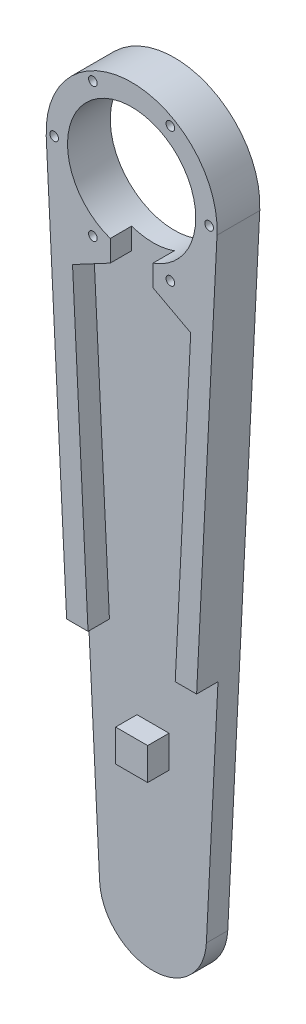
ISO-10303-21;
HEADER;
FILE_DESCRIPTION(('STEP AP214'),'2;1');
FILE_NAME('part.step','',(''),(''),'','','');
FILE_SCHEMA(('AUTOMOTIVE_DESIGN { 1 0 10303 214 1 1 1 1 }'));
ENDSEC;
DATA;
#1=APPLICATION_CONTEXT('core data for automotive mechanical design processes');
#2=APPLICATION_PROTOCOL_DEFINITION('international standard','automotive_design',2000,#1);
#3=PRODUCT_CONTEXT('',#1,'mechanical');
#4=PRODUCT('Part','Part','',(#3));
#5=PRODUCT_RELATED_PRODUCT_CATEGORY('part','',(#4));
#6=PRODUCT_DEFINITION_FORMATION('','',#4);
#7=PRODUCT_DEFINITION_CONTEXT('part definition',#1,'design');
#8=PRODUCT_DEFINITION('design','',#6,#7);
#9=PRODUCT_DEFINITION_SHAPE('','',#8);
#10=(LENGTH_UNIT() NAMED_UNIT(*) SI_UNIT(.MILLI.,.METRE.));
#11=(NAMED_UNIT(*) PLANE_ANGLE_UNIT() SI_UNIT($,.RADIAN.));
#12=(NAMED_UNIT(*) SI_UNIT($,.STERADIAN.) SOLID_ANGLE_UNIT());
#13=UNCERTAINTY_MEASURE_WITH_UNIT(LENGTH_MEASURE(1.E-05),#10,'distance_accuracy_value','');
#14=(GEOMETRIC_REPRESENTATION_CONTEXT(3) GLOBAL_UNCERTAINTY_ASSIGNED_CONTEXT((#13)) GLOBAL_UNIT_ASSIGNED_CONTEXT((#10,
#11,#12)) REPRESENTATION_CONTEXT('',''));
#15=CARTESIAN_POINT('',(0.,0.,0.));
#16=DIRECTION('',(0.,0.,1.));
#17=DIRECTION('',(1.,0.,0.));
#18=AXIS2_PLACEMENT_3D('',#15,#16,#17);
#19=CARTESIAN_POINT('',(0.,0.,0.));
#20=DIRECTION('',(0.,0.,1.));
#21=DIRECTION('',(1.,0.,0.));
#22=AXIS2_PLACEMENT_3D('',#19,#20,#21);
#23=PLANE('',#22);
#24=DIRECTION('',(-1.,0.,0.));
#25=VECTOR('',#24,1.);
#26=CARTESIAN_POINT('',(0.,-192.690398551587,0.));
#27=LINE('',#26,#25);
#28=CARTESIAN_POINT('',(-20.3909847537626,-192.690398551587,0.));
#29=VERTEX_POINT('',#28);
#30=CARTESIAN_POINT('',(-30.4035082401991,-192.690398551587,0.));
#31=VERTEX_POINT('',#30);
#32=EDGE_CURVE('E240',#29,#31,#27,.T.);
#33=ORIENTED_EDGE('',*,*,#32,.T.);
#34=DIRECTION('',(0.05,-0.998749217771909,0.));
#35=VECTOR('',#34,1.);
#36=CARTESIAN_POINT('',(-39.9499687108764,-2.,0.));
#37=LINE('',#36,#35);
#38=CARTESIAN_POINT('',(-24.9687304442977,-301.25,0.));
#39=VERTEX_POINT('',#38);
#40=EDGE_CURVE('E330',#31,#39,#37,.T.);
#41=ORIENTED_EDGE('',*,*,#40,.T.);
#42=CARTESIAN_POINT('',(0.,-300.,0.));
#43=DIRECTION('',(0.,0.,1.));
#44=DIRECTION('',(1.,0.,0.));
#45=AXIS2_PLACEMENT_3D('',#42,#43,#44);
#46=CIRCLE('',#45,25.);
#47=CARTESIAN_POINT('',(24.9687304442977,-301.25,0.));
#48=VERTEX_POINT('',#47);
#49=EDGE_CURVE('E339',#39,#48,#46,.T.);
#50=ORIENTED_EDGE('',*,*,#49,.T.);
#51=DIRECTION('',(-0.05,-0.998749217771909,0.));
#52=VECTOR('',#51,1.);
#53=CARTESIAN_POINT('',(39.9499687108764,-2.,0.));
#54=LINE('',#53,#52);
#55=CARTESIAN_POINT('',(30.4035082401991,-192.690398551587,0.));
#56=VERTEX_POINT('',#55);
#57=EDGE_CURVE('E334',#56,#48,#54,.T.);
#58=ORIENTED_EDGE('',*,*,#57,.F.);
#59=DIRECTION('',(1.,0.,0.));
#60=VECTOR('',#59,1.);
#61=CARTESIAN_POINT('',(0.,-192.690398551587,0.));
#62=LINE('',#61,#60);
#63=CARTESIAN_POINT('',(20.390984753764,-192.690398551587,0.));
#64=VERTEX_POINT('',#63);
#65=EDGE_CURVE('E255',#64,#56,#62,.T.);
#66=ORIENTED_EDGE('',*,*,#65,.F.);
#67=DIRECTION('',(-0.0499999999999999,-0.998749217771909,0.));
#68=VECTOR('',#67,1.);
#69=CARTESIAN_POINT('',(29.9624765331573,-1.5,0.));
#70=LINE('',#69,#68);
#71=CARTESIAN_POINT('',(27.6500642814294,-47.690398551587,0.));
#72=VERTEX_POINT('',#71);
#73=EDGE_CURVE('E252',#72,#64,#70,.T.);
#74=ORIENTED_EDGE('',*,*,#73,.F.);
#75=DIRECTION('',(0.882503214071472,-0.470306365206257,0.));
#76=VECTOR('',#75,1.);
#77=CARTESIAN_POINT('',(-13.677886520409,-25.665778116084,0.));
#78=LINE('',#77,#76);
#79=CARTESIAN_POINT('',(10.,-38.2842712474619,0.));
#80=VERTEX_POINT('',#79);
#81=EDGE_CURVE('E249',#80,#72,#78,.T.);
#82=ORIENTED_EDGE('',*,*,#81,.F.);
#83=DIRECTION('',(0.,-1.,0.));
#84=VECTOR('',#83,1.);
#85=CARTESIAN_POINT('',(10.,0.,0.));
#86=LINE('',#85,#84);
#87=CARTESIAN_POINT('',(10.,-28.2842712474619,0.));
#88=VERTEX_POINT('',#87);
#89=EDGE_CURVE('E246',#88,#80,#86,.T.);
#90=ORIENTED_EDGE('',*,*,#89,.F.);
#91=CARTESIAN_POINT('',(0.,0.,0.));
#92=DIRECTION('',(0.,0.,1.));
#93=DIRECTION('',(1.,0.,0.));
#94=AXIS2_PLACEMENT_3D('',#91,#92,#93);
#95=CIRCLE('',#94,30.);
#96=CARTESIAN_POINT('',(-9.9999999999998,-28.284271247462,0.));
#97=VERTEX_POINT('',#96);
#98=EDGE_CURVE('E386',#97,#88,#95,.T.);
#99=ORIENTED_EDGE('',*,*,#98,.F.);
#100=DIRECTION('',(0.,-1.,0.));
#101=VECTOR('',#100,1.);
#102=CARTESIAN_POINT('',(-10.,0.,0.));
#103=LINE('',#102,#101);
#104=CARTESIAN_POINT('',(-9.99999999999973,-38.2842712474619,0.));
#105=VERTEX_POINT('',#104);
#106=EDGE_CURVE('E244',#97,#105,#103,.T.);
#107=ORIENTED_EDGE('',*,*,#106,.T.);
#108=DIRECTION('',(-0.882503214071467,-0.470306365206267,0.));
#109=VECTOR('',#108,1.);
#110=CARTESIAN_POINT('',(13.6778865204092,-25.6657781160837,0.));
#111=LINE('',#110,#109);
#112=CARTESIAN_POINT('',(-27.6500642814291,-47.6903985515873,0.));
#113=VERTEX_POINT('',#112);
#114=EDGE_CURVE('E63',#105,#113,#111,.T.);
#115=ORIENTED_EDGE('',*,*,#114,.T.);
#116=DIRECTION('',(0.0500000000000069,-0.998749217771909,0.));
#117=VECTOR('',#116,1.);
#118=CARTESIAN_POINT('',(-29.9624765331573,-1.50000000000021,0.));
#119=LINE('',#118,#117);
#120=EDGE_CURVE('E58',#113,#29,#119,.T.);
#121=ORIENTED_EDGE('',*,*,#120,.T.);
#122=EDGE_LOOP('',(#33,#41,#50,#58,#66,#74,#82,#90,#99,#107,#115,#121));
#123=FACE_BOUND('',#122,.T.);
#124=DIRECTION('',(0.,-1.,0.));
#125=VECTOR('',#124,1.);
#126=CARTESIAN_POINT('',(-7.50000000000003,0.,0.));
#127=LINE('',#126,#125);
#128=CARTESIAN_POINT('',(-7.5,-225.,0.));
#129=VERTEX_POINT('',#128);
#130=CARTESIAN_POINT('',(-7.5,-240.,0.));
#131=VERTEX_POINT('',#130);
#132=EDGE_CURVE('E312',#129,#131,#127,.T.);
#133=ORIENTED_EDGE('',*,*,#132,.F.);
#134=DIRECTION('',(-1.,0.,0.));
#135=VECTOR('',#134,1.);
#136=CARTESIAN_POINT('',(0.,-225.,0.));
#137=LINE('',#136,#135);
#138=CARTESIAN_POINT('',(7.50000000000002,-225.,0.));
#139=VERTEX_POINT('',#138);
#140=EDGE_CURVE('E297',#139,#129,#137,.T.);
#141=ORIENTED_EDGE('',*,*,#140,.F.);
#142=DIRECTION('',(0.,-1.,0.));
#143=VECTOR('',#142,1.);
#144=CARTESIAN_POINT('',(7.50000000000003,0.,0.));
#145=LINE('',#144,#143);
#146=CARTESIAN_POINT('',(7.5,-240.,0.));
#147=VERTEX_POINT('',#146);
#148=EDGE_CURVE('E302',#139,#147,#145,.T.);
#149=ORIENTED_EDGE('',*,*,#148,.T.);
#150=DIRECTION('',(1.,0.,0.));
#151=VECTOR('',#150,1.);
#152=CARTESIAN_POINT('',(0.,-240.,0.));
#153=LINE('',#152,#151);
#154=EDGE_CURVE('E315',#131,#147,#153,.T.);
#155=ORIENTED_EDGE('',*,*,#154,.F.);
#156=EDGE_LOOP('',(#133,#141,#149,#155));
#157=FACE_BOUND('',#156,.T.);
#158=ADVANCED_FACE('F43',(#123,#157),#23,.T.);
#159=CARTESIAN_POINT('',(0.,0.,-10.));
#160=DIRECTION('',(0.,0.,1.));
#161=DIRECTION('',(1.,0.,0.));
#162=AXIS2_PLACEMENT_3D('',#159,#160,#161);
#163=CYLINDRICAL_SURFACE('',#162,40.);
#164=DIRECTION('',(0.,0.,1.));
#165=VECTOR('',#164,1.);
#166=CARTESIAN_POINT('',(-39.9499687108764,-2.,-10.));
#167=LINE('',#166,#165);
#168=CARTESIAN_POINT('',(-39.9499687108764,-2.,-10.));
#169=VERTEX_POINT('',#168);
#170=CARTESIAN_POINT('',(-39.9499687108764,-2.,10.));
#171=VERTEX_POINT('',#170);
#172=EDGE_CURVE('E167',#169,#171,#167,.T.);
#173=ORIENTED_EDGE('',*,*,#172,.T.);
#174=CARTESIAN_POINT('',(0.,0.,10.));
#175=DIRECTION('',(0.,0.,1.));
#176=DIRECTION('',(1.,0.,0.));
#177=AXIS2_PLACEMENT_3D('',#174,#175,#176);
#178=CIRCLE('',#177,40.);
#179=CARTESIAN_POINT('',(39.9499687108764,-2.,10.));
#180=VERTEX_POINT('',#179);
#181=EDGE_CURVE('E171',#180,#171,#178,.T.);
#182=ORIENTED_EDGE('',*,*,#181,.F.);
#183=DIRECTION('',(0.,0.,1.));
#184=VECTOR('',#183,1.);
#185=CARTESIAN_POINT('',(39.9499687108764,-2.,-10.));
#186=LINE('',#185,#184);
#187=CARTESIAN_POINT('',(39.9499687108764,-2.,-10.));
#188=VERTEX_POINT('',#187);
#189=EDGE_CURVE('E343',#188,#180,#186,.T.);
#190=ORIENTED_EDGE('',*,*,#189,.F.);
#191=CARTESIAN_POINT('',(0.,0.,-10.));
#192=DIRECTION('',(0.,0.,1.));
#193=DIRECTION('',(1.,0.,0.));
#194=AXIS2_PLACEMENT_3D('',#191,#192,#193);
#195=CIRCLE('',#194,40.);
#196=EDGE_CURVE('E11',#188,#169,#195,.T.);
#197=ORIENTED_EDGE('',*,*,#196,.T.);
#198=EDGE_LOOP('',(#173,#182,#190,#197));
#199=FACE_BOUND('',#198,.T.);
#200=ADVANCED_FACE('F45',(#199),#163,.T.);
#201=CARTESIAN_POINT('',(0.,0.,-10.));
#202=DIRECTION('',(0.,0.,1.));
#203=DIRECTION('',(1.,0.,0.));
#204=AXIS2_PLACEMENT_3D('',#201,#202,#203);
#205=PLANE('',#204);
#206=CARTESIAN_POINT('',(18.1250000000004,31.3934208871857,-10.));
#207=DIRECTION('',(0.,0.,1.));
#208=DIRECTION('',(1.,0.,0.));
#209=AXIS2_PLACEMENT_3D('',#206,#207,#208);
#210=CIRCLE('',#209,1.65);
#211=CARTESIAN_POINT('',(19.7750000000004,31.3934208871857,-10.));
#212=VERTEX_POINT('',#211);
#213=EDGE_CURVE('E353',#212,#212,#210,.T.);
#214=ORIENTED_EDGE('',*,*,#213,.T.);
#215=EDGE_LOOP('',(#214));
#216=FACE_BOUND('',#215,.T.);
#217=CARTESIAN_POINT('',(-18.1249999999997,31.3934208871861,-10.));
#218=DIRECTION('',(0.,0.,1.));
#219=DIRECTION('',(1.,0.,0.));
#220=AXIS2_PLACEMENT_3D('',#217,#218,#219);
#221=CIRCLE('',#220,1.65);
#222=CARTESIAN_POINT('',(-16.4749999999997,31.3934208871861,-10.));
#223=VERTEX_POINT('',#222);
#224=EDGE_CURVE('E359',#223,#223,#221,.T.);
#225=ORIENTED_EDGE('',*,*,#224,.T.);
#226=EDGE_LOOP('',(#225));
#227=FACE_BOUND('',#226,.T.);
#228=CARTESIAN_POINT('',(-36.25,0.,-10.));
#229=DIRECTION('',(0.,0.,1.));
#230=DIRECTION('',(1.,0.,0.));
#231=AXIS2_PLACEMENT_3D('',#228,#229,#230);
#232=CIRCLE('',#231,1.65);
#233=CARTESIAN_POINT('',(-34.6,0.,-10.));
#234=VERTEX_POINT('',#233);
#235=EDGE_CURVE('E365',#234,#234,#232,.T.);
#236=ORIENTED_EDGE('',*,*,#235,.T.);
#237=EDGE_LOOP('',(#236));
#238=FACE_BOUND('',#237,.T.);
#239=CARTESIAN_POINT('',(-18.1250000000001,-31.3934208871858,-10.));
#240=DIRECTION('',(0.,0.,1.));
#241=DIRECTION('',(1.,0.,0.));
#242=AXIS2_PLACEMENT_3D('',#239,#240,#241);
#243=CIRCLE('',#242,1.65);
#244=CARTESIAN_POINT('',(-16.4750000000002,-31.3934208871858,-10.));
#245=VERTEX_POINT('',#244);
#246=EDGE_CURVE('E371',#245,#245,#243,.T.);
#247=ORIENTED_EDGE('',*,*,#246,.T.);
#248=EDGE_LOOP('',(#247));
#249=FACE_BOUND('',#248,.T.);
#250=CARTESIAN_POINT('',(18.1249999999999,-31.3934208871859,-10.));
#251=DIRECTION('',(0.,0.,1.));
#252=DIRECTION('',(1.,0.,0.));
#253=AXIS2_PLACEMENT_3D('',#250,#251,#252);
#254=CIRCLE('',#253,1.65);
#255=CARTESIAN_POINT('',(19.7749999999999,-31.3934208871859,-10.));
#256=VERTEX_POINT('',#255);
#257=EDGE_CURVE('E377',#256,#256,#254,.T.);
#258=ORIENTED_EDGE('',*,*,#257,.T.);
#259=EDGE_LOOP('',(#258));
#260=FACE_BOUND('',#259,.T.);
#261=CARTESIAN_POINT('',(36.25,0.,-10.));
#262=DIRECTION('',(0.,0.,1.));
#263=DIRECTION('',(1.,0.,0.));
#264=AXIS2_PLACEMENT_3D('',#261,#262,#263);
#265=CIRCLE('',#264,1.65);
#266=CARTESIAN_POINT('',(37.9,0.,-10.));
#267=VERTEX_POINT('',#266);
#268=EDGE_CURVE('E383',#267,#267,#265,.T.);
#269=ORIENTED_EDGE('',*,*,#268,.T.);
#270=EDGE_LOOP('',(#269));
#271=FACE_BOUND('',#270,.T.);
#272=CARTESIAN_POINT('',(0.,0.,-10.));
#273=DIRECTION('',(0.,0.,1.));
#274=DIRECTION('',(1.,0.,0.));
#275=AXIS2_PLACEMENT_3D('',#272,#273,#274);
#276=CIRCLE('',#275,30.);
#277=CARTESIAN_POINT('',(30.,0.,-10.));
#278=VERTEX_POINT('',#277);
#279=EDGE_CURVE('E51',#278,#278,#276,.T.);
#280=ORIENTED_EDGE('',*,*,#279,.T.);
#281=EDGE_LOOP('',(#280));
#282=FACE_BOUND('',#281,.T.);
#283=ORIENTED_EDGE('',*,*,#196,.F.);
#284=DIRECTION('',(-0.05,-0.998749217771909,0.));
#285=VECTOR('',#284,1.);
#286=CARTESIAN_POINT('',(39.9499687108764,-2.,-10.));
#287=LINE('',#286,#285);
#288=CARTESIAN_POINT('',(24.9687304442977,-301.25,-10.));
#289=VERTEX_POINT('',#288);
#290=EDGE_CURVE('E177',#188,#289,#287,.T.);
#291=ORIENTED_EDGE('',*,*,#290,.T.);
#292=CARTESIAN_POINT('',(0.,-300.,-10.));
#293=DIRECTION('',(0.,0.,1.));
#294=DIRECTION('',(1.,0.,0.));
#295=AXIS2_PLACEMENT_3D('',#292,#293,#294);
#296=CIRCLE('',#295,25.);
#297=CARTESIAN_POINT('',(-24.9687304442977,-301.25,-10.));
#298=VERTEX_POINT('',#297);
#299=EDGE_CURVE('E333',#298,#289,#296,.T.);
#300=ORIENTED_EDGE('',*,*,#299,.F.);
#301=DIRECTION('',(0.05,-0.998749217771909,0.));
#302=VECTOR('',#301,1.);
#303=CARTESIAN_POINT('',(-39.9499687108764,-2.,-10.));
#304=LINE('',#303,#302);
#305=EDGE_CURVE('E331',#169,#298,#304,.T.);
#306=ORIENTED_EDGE('',*,*,#305,.F.);
#307=EDGE_LOOP('',(#283,#291,#300,#306));
#308=FACE_BOUND('',#307,.T.);
#309=ADVANCED_FACE('F504',(#216,#227,#238,#249,#260,#271,#282,#308),#205,.F.);
#310=CARTESIAN_POINT('',(0.,0.,-10.));
#311=DIRECTION('',(0.,0.,1.));
#312=DIRECTION('',(1.,0.,0.));
#313=AXIS2_PLACEMENT_3D('',#310,#311,#312);
#314=CYLINDRICAL_SURFACE('',#313,30.);
#315=ORIENTED_EDGE('',*,*,#279,.F.);
#316=EDGE_LOOP('',(#315));
#317=FACE_BOUND('',#316,.T.);
#318=ORIENTED_EDGE('',*,*,#98,.T.);
#319=DIRECTION('',(0.,0.,-1.));
#320=VECTOR('',#319,1.);
#321=CARTESIAN_POINT('',(10.,-28.2842712474619,10.));
#322=LINE('',#321,#320);
#323=CARTESIAN_POINT('',(10.,-28.2842712474619,10.));
#324=VERTEX_POINT('',#323);
#325=EDGE_CURVE('E283',#324,#88,#322,.T.);
#326=ORIENTED_EDGE('',*,*,#325,.F.);
#327=CARTESIAN_POINT('',(0.,0.,10.));
#328=DIRECTION('',(0.,0.,1.));
#329=DIRECTION('',(1.,0.,0.));
#330=AXIS2_PLACEMENT_3D('',#327,#328,#329);
#331=CIRCLE('',#330,30.);
#332=CARTESIAN_POINT('',(-9.9999999999998,-28.284271247462,10.));
#333=VERTEX_POINT('',#332);
#334=EDGE_CURVE('E210',#333,#324,#331,.F.);
#335=ORIENTED_EDGE('',*,*,#334,.F.);
#336=DIRECTION('',(0.,0.,-1.));
#337=VECTOR('',#336,1.);
#338=CARTESIAN_POINT('',(-9.9999999999998,-28.284271247462,10.));
#339=LINE('',#338,#337);
#340=EDGE_CURVE('E286',#333,#97,#339,.T.);
#341=ORIENTED_EDGE('',*,*,#340,.T.);
#342=EDGE_LOOP('',(#318,#326,#335,#341));
#343=FACE_BOUND('',#342,.T.);
#344=ADVANCED_FACE('F391',(#317,#343),#314,.F.);
#345=CARTESIAN_POINT('',(36.25,0.,0.));
#346=DIRECTION('',(0.,0.,1.));
#347=DIRECTION('',(1.,0.,0.));
#348=AXIS2_PLACEMENT_3D('',#345,#346,#347);
#349=CYLINDRICAL_SURFACE('',#348,1.65);
#350=ORIENTED_EDGE('',*,*,#268,.F.);
#351=EDGE_LOOP('',(#350));
#352=FACE_BOUND('',#351,.T.);
#353=CARTESIAN_POINT('',(36.25,0.,-0.375000000000001));
#354=DIRECTION('',(0.,0.,1.));
#355=DIRECTION('',(1.,0.,0.));
#356=AXIS2_PLACEMENT_3D('',#353,#354,#355);
#357=CIRCLE('',#356,1.65);
#358=CARTESIAN_POINT('',(37.9,0.,-0.375000000000001));
#359=VERTEX_POINT('',#358);
#360=EDGE_CURVE('E380',#359,#359,#357,.T.);
#361=ORIENTED_EDGE('',*,*,#360,.T.);
#362=EDGE_LOOP('',(#361));
#363=FACE_BOUND('',#362,.T.);
#364=ADVANCED_FACE('F497',(#352,#363),#349,.F.);
#365=CARTESIAN_POINT('',(36.25,0.,0.));
#366=DIRECTION('',(0.,0.,1.));
#367=DIRECTION('',(1.,0.,0.));
#368=AXIS2_PLACEMENT_3D('',#365,#366,#367);
#369=CONICAL_SURFACE('',#368,2.025,0.785398163397445);
#370=ORIENTED_EDGE('',*,*,#360,.F.);
#371=EDGE_LOOP('',(#370));
#372=FACE_BOUND('',#371,.T.);
#373=CARTESIAN_POINT('',(36.25,0.,0.));
#374=DIRECTION('',(0.,0.,1.));
#375=DIRECTION('',(1.,0.,0.));
#376=AXIS2_PLACEMENT_3D('',#373,#374,#375);
#377=CIRCLE('',#376,2.025);
#378=CARTESIAN_POINT('',(38.275,0.,0.));
#379=VERTEX_POINT('',#378);
#380=EDGE_CURVE('E258',#379,#379,#377,.F.);
#381=ORIENTED_EDGE('',*,*,#380,.F.);
#382=EDGE_LOOP('',(#381));
#383=FACE_BOUND('',#382,.T.);
#384=ADVANCED_FACE('F493',(#372,#383),#369,.F.);
#385=CARTESIAN_POINT('',(18.1249999999999,-31.3934208871859,0.));
#386=DIRECTION('',(0.,0.,1.));
#387=DIRECTION('',(1.,0.,0.));
#388=AXIS2_PLACEMENT_3D('',#385,#386,#387);
#389=CYLINDRICAL_SURFACE('',#388,1.65);
#390=ORIENTED_EDGE('',*,*,#257,.F.);
#391=EDGE_LOOP('',(#390));
#392=FACE_BOUND('',#391,.T.);
#393=CARTESIAN_POINT('',(18.1249999999999,-31.3934208871859,-0.375000000000001));
#394=DIRECTION('',(0.,0.,1.));
#395=DIRECTION('',(1.,0.,0.));
#396=AXIS2_PLACEMENT_3D('',#393,#394,#395);
#397=CIRCLE('',#396,1.65);
#398=CARTESIAN_POINT('',(19.7749999999999,-31.3934208871859,-0.375000000000001));
#399=VERTEX_POINT('',#398);
#400=EDGE_CURVE('E374',#399,#399,#397,.T.);
#401=ORIENTED_EDGE('',*,*,#400,.T.);
#402=EDGE_LOOP('',(#401));
#403=FACE_BOUND('',#402,.T.);
#404=ADVANCED_FACE('F489',(#392,#403),#389,.F.);
#405=CARTESIAN_POINT('',(18.1249999999999,-31.3934208871859,0.));
#406=DIRECTION('',(0.,0.,1.));
#407=DIRECTION('',(1.,0.,0.));
#408=AXIS2_PLACEMENT_3D('',#405,#406,#407);
#409=CONICAL_SURFACE('',#408,2.025,0.785398163397445);
#410=ORIENTED_EDGE('',*,*,#400,.F.);
#411=EDGE_LOOP('',(#410));
#412=FACE_BOUND('',#411,.T.);
#413=CARTESIAN_POINT('',(18.1249999999999,-31.3934208871859,0.));
#414=DIRECTION('',(0.,0.,1.));
#415=DIRECTION('',(1.,0.,0.));
#416=AXIS2_PLACEMENT_3D('',#413,#414,#415);
#417=CIRCLE('',#416,2.025);
#418=CARTESIAN_POINT('',(20.1499999999999,-31.3934208871859,0.));
#419=VERTEX_POINT('',#418);
#420=EDGE_CURVE('E261',#419,#419,#417,.F.);
#421=ORIENTED_EDGE('',*,*,#420,.F.);
#422=EDGE_LOOP('',(#421));
#423=FACE_BOUND('',#422,.T.);
#424=ADVANCED_FACE('F485',(#412,#423),#409,.F.);
#425=CARTESIAN_POINT('',(-18.1250000000001,-31.3934208871858,0.));
#426=DIRECTION('',(0.,0.,1.));
#427=DIRECTION('',(1.,0.,0.));
#428=AXIS2_PLACEMENT_3D('',#425,#426,#427);
#429=CYLINDRICAL_SURFACE('',#428,1.65);
#430=ORIENTED_EDGE('',*,*,#246,.F.);
#431=EDGE_LOOP('',(#430));
#432=FACE_BOUND('',#431,.T.);
#433=CARTESIAN_POINT('',(-18.1250000000001,-31.3934208871858,-0.375000000000001));
#434=DIRECTION('',(0.,0.,1.));
#435=DIRECTION('',(1.,0.,0.));
#436=AXIS2_PLACEMENT_3D('',#433,#434,#435);
#437=CIRCLE('',#436,1.65);
#438=CARTESIAN_POINT('',(-16.4750000000002,-31.3934208871858,-0.375000000000001));
#439=VERTEX_POINT('',#438);
#440=EDGE_CURVE('E368',#439,#439,#437,.T.);
#441=ORIENTED_EDGE('',*,*,#440,.T.);
#442=EDGE_LOOP('',(#441));
#443=FACE_BOUND('',#442,.T.);
#444=ADVANCED_FACE('F481',(#432,#443),#429,.F.);
#445=CARTESIAN_POINT('',(-18.1250000000001,-31.3934208871858,0.));
#446=DIRECTION('',(0.,0.,1.));
#447=DIRECTION('',(1.,0.,0.));
#448=AXIS2_PLACEMENT_3D('',#445,#446,#447);
#449=CONICAL_SURFACE('',#448,2.025,0.785398163397445);
#450=ORIENTED_EDGE('',*,*,#440,.F.);
#451=EDGE_LOOP('',(#450));
#452=FACE_BOUND('',#451,.T.);
#453=CARTESIAN_POINT('',(-18.1250000000001,-31.3934208871858,0.));
#454=DIRECTION('',(0.,0.,1.));
#455=DIRECTION('',(1.,0.,0.));
#456=AXIS2_PLACEMENT_3D('',#453,#454,#455);
#457=CIRCLE('',#456,2.025);
#458=CARTESIAN_POINT('',(-16.1000000000002,-31.3934208871858,0.));
#459=VERTEX_POINT('',#458);
#460=EDGE_CURVE('E197',#459,#459,#457,.F.);
#461=ORIENTED_EDGE('',*,*,#460,.F.);
#462=EDGE_LOOP('',(#461));
#463=FACE_BOUND('',#462,.T.);
#464=ADVANCED_FACE('F477',(#452,#463),#449,.F.);
#465=CARTESIAN_POINT('',(-36.25,0.,0.));
#466=DIRECTION('',(0.,0.,1.));
#467=DIRECTION('',(1.,0.,0.));
#468=AXIS2_PLACEMENT_3D('',#465,#466,#467);
#469=CYLINDRICAL_SURFACE('',#468,1.65);
#470=ORIENTED_EDGE('',*,*,#235,.F.);
#471=EDGE_LOOP('',(#470));
#472=FACE_BOUND('',#471,.T.);
#473=CARTESIAN_POINT('',(-36.25,0.,-0.375000000000001));
#474=DIRECTION('',(0.,0.,1.));
#475=DIRECTION('',(1.,0.,0.));
#476=AXIS2_PLACEMENT_3D('',#473,#474,#475);
#477=CIRCLE('',#476,1.65);
#478=CARTESIAN_POINT('',(-34.6,0.,-0.375000000000001));
#479=VERTEX_POINT('',#478);
#480=EDGE_CURVE('E362',#479,#479,#477,.T.);
#481=ORIENTED_EDGE('',*,*,#480,.T.);
#482=EDGE_LOOP('',(#481));
#483=FACE_BOUND('',#482,.T.);
#484=ADVANCED_FACE('F473',(#472,#483),#469,.F.);
#485=CARTESIAN_POINT('',(-36.25,0.,0.));
#486=DIRECTION('',(0.,0.,1.));
#487=DIRECTION('',(1.,0.,0.));
#488=AXIS2_PLACEMENT_3D('',#485,#486,#487);
#489=CONICAL_SURFACE('',#488,2.025,0.785398163397445);
#490=ORIENTED_EDGE('',*,*,#480,.F.);
#491=EDGE_LOOP('',(#490));
#492=FACE_BOUND('',#491,.T.);
#493=CARTESIAN_POINT('',(-36.25,0.,0.));
#494=DIRECTION('',(0.,0.,1.));
#495=DIRECTION('',(1.,0.,0.));
#496=AXIS2_PLACEMENT_3D('',#493,#494,#495);
#497=CIRCLE('',#496,2.025);
#498=CARTESIAN_POINT('',(-34.225,0.,0.));
#499=VERTEX_POINT('',#498);
#500=EDGE_CURVE('E267',#499,#499,#497,.F.);
#501=ORIENTED_EDGE('',*,*,#500,.F.);
#502=EDGE_LOOP('',(#501));
#503=FACE_BOUND('',#502,.T.);
#504=ADVANCED_FACE('F469',(#492,#503),#489,.F.);
#505=CARTESIAN_POINT('',(-18.1249999999997,31.3934208871861,0.));
#506=DIRECTION('',(0.,0.,1.));
#507=DIRECTION('',(1.,0.,0.));
#508=AXIS2_PLACEMENT_3D('',#505,#506,#507);
#509=CYLINDRICAL_SURFACE('',#508,1.65);
#510=ORIENTED_EDGE('',*,*,#224,.F.);
#511=EDGE_LOOP('',(#510));
#512=FACE_BOUND('',#511,.T.);
#513=CARTESIAN_POINT('',(-18.1249999999997,31.3934208871861,-0.375000000000001));
#514=DIRECTION('',(0.,0.,1.));
#515=DIRECTION('',(1.,0.,0.));
#516=AXIS2_PLACEMENT_3D('',#513,#514,#515);
#517=CIRCLE('',#516,1.65);
#518=CARTESIAN_POINT('',(-16.4749999999997,31.3934208871861,-0.375000000000001));
#519=VERTEX_POINT('',#518);
#520=EDGE_CURVE('E356',#519,#519,#517,.T.);
#521=ORIENTED_EDGE('',*,*,#520,.T.);
#522=EDGE_LOOP('',(#521));
#523=FACE_BOUND('',#522,.T.);
#524=ADVANCED_FACE('F465',(#512,#523),#509,.F.);
#525=CARTESIAN_POINT('',(-18.1249999999997,31.3934208871861,0.));
#526=DIRECTION('',(0.,0.,1.));
#527=DIRECTION('',(1.,0.,0.));
#528=AXIS2_PLACEMENT_3D('',#525,#526,#527);
#529=CONICAL_SURFACE('',#528,2.025,0.785398163397445);
#530=ORIENTED_EDGE('',*,*,#520,.F.);
#531=EDGE_LOOP('',(#530));
#532=FACE_BOUND('',#531,.T.);
#533=CARTESIAN_POINT('',(-18.1249999999997,31.3934208871861,0.));
#534=DIRECTION('',(0.,0.,1.));
#535=DIRECTION('',(1.,0.,0.));
#536=AXIS2_PLACEMENT_3D('',#533,#534,#535);
#537=CIRCLE('',#536,2.025);
#538=CARTESIAN_POINT('',(-16.0999999999997,31.3934208871861,0.));
#539=VERTEX_POINT('',#538);
#540=EDGE_CURVE('E194',#539,#539,#537,.F.);
#541=ORIENTED_EDGE('',*,*,#540,.F.);
#542=EDGE_LOOP('',(#541));
#543=FACE_BOUND('',#542,.T.);
#544=ADVANCED_FACE('F461',(#532,#543),#529,.F.);
#545=CARTESIAN_POINT('',(18.1250000000004,31.3934208871857,0.));
#546=DIRECTION('',(0.,0.,1.));
#547=DIRECTION('',(1.,0.,0.));
#548=AXIS2_PLACEMENT_3D('',#545,#546,#547);
#549=CYLINDRICAL_SURFACE('',#548,1.65);
#550=ORIENTED_EDGE('',*,*,#213,.F.);
#551=EDGE_LOOP('',(#550));
#552=FACE_BOUND('',#551,.T.);
#553=CARTESIAN_POINT('',(18.1250000000004,31.3934208871857,-0.375000000000001));
#554=DIRECTION('',(0.,0.,1.));
#555=DIRECTION('',(1.,0.,0.));
#556=AXIS2_PLACEMENT_3D('',#553,#554,#555);
#557=CIRCLE('',#556,1.65);
#558=CARTESIAN_POINT('',(19.7750000000004,31.3934208871857,-0.375000000000001));
#559=VERTEX_POINT('',#558);
#560=EDGE_CURVE('E345',#559,#559,#557,.T.);
#561=ORIENTED_EDGE('',*,*,#560,.T.);
#562=EDGE_LOOP('',(#561));
#563=FACE_BOUND('',#562,.T.);
#564=ADVANCED_FACE('F457',(#552,#563),#549,.F.);
#565=CARTESIAN_POINT('',(18.1250000000004,31.3934208871857,0.));
#566=DIRECTION('',(0.,0.,1.));
#567=DIRECTION('',(1.,0.,0.));
#568=AXIS2_PLACEMENT_3D('',#565,#566,#567);
#569=CONICAL_SURFACE('',#568,2.025,0.785398163397445);
#570=ORIENTED_EDGE('',*,*,#560,.F.);
#571=EDGE_LOOP('',(#570));
#572=FACE_BOUND('',#571,.T.);
#573=CARTESIAN_POINT('',(18.1250000000004,31.3934208871857,0.));
#574=DIRECTION('',(0.,0.,1.));
#575=DIRECTION('',(1.,0.,0.));
#576=AXIS2_PLACEMENT_3D('',#573,#574,#575);
#577=CIRCLE('',#576,2.025);
#578=CARTESIAN_POINT('',(20.1500000000004,31.3934208871857,0.));
#579=VERTEX_POINT('',#578);
#580=EDGE_CURVE('E264',#579,#579,#577,.F.);
#581=ORIENTED_EDGE('',*,*,#580,.F.);
#582=EDGE_LOOP('',(#581));
#583=FACE_BOUND('',#582,.T.);
#584=ADVANCED_FACE('F448',(#572,#583),#569,.F.);
#585=CARTESIAN_POINT('',(39.9499687108764,-2.,-10.));
#586=DIRECTION('',(-0.998749217771909,0.05,0.));
#587=DIRECTION('',(-0.05,-0.998749217771909,0.));
#588=AXIS2_PLACEMENT_3D('',#585,#586,#587);
#589=PLANE('',#588);
#590=ORIENTED_EDGE('',*,*,#189,.T.);
#591=DIRECTION('',(0.05,0.998749217771909,0.));
#592=VECTOR('',#591,1.);
#593=CARTESIAN_POINT('',(39.9499687108764,-2.,10.));
#594=LINE('',#593,#592);
#595=CARTESIAN_POINT('',(30.4035082401991,-192.690398551587,10.));
#596=VERTEX_POINT('',#595);
#597=EDGE_CURVE('E193',#596,#180,#594,.T.);
#598=ORIENTED_EDGE('',*,*,#597,.F.);
#599=DIRECTION('',(0.,0.,-1.));
#600=VECTOR('',#599,1.);
#601=CARTESIAN_POINT('',(30.4035082401991,-192.690398551587,10.));
#602=LINE('',#601,#600);
#603=EDGE_CURVE('E239',#596,#56,#602,.T.);
#604=ORIENTED_EDGE('',*,*,#603,.T.);
#605=ORIENTED_EDGE('',*,*,#57,.T.);
#606=DIRECTION('',(0.,0.,1.));
#607=VECTOR('',#606,1.);
#608=CARTESIAN_POINT('',(24.9687304442977,-301.25,-10.));
#609=LINE('',#608,#607);
#610=EDGE_CURVE('E346',#289,#48,#609,.T.);
#611=ORIENTED_EDGE('',*,*,#610,.F.);
#612=ORIENTED_EDGE('',*,*,#290,.F.);
#613=EDGE_LOOP('',(#590,#598,#604,#605,#611,#612));
#614=FACE_BOUND('',#613,.T.);
#615=ADVANCED_FACE('F444',(#614),#589,.F.);
#616=CARTESIAN_POINT('',(0.,-300.,-10.));
#617=DIRECTION('',(0.,0.,1.));
#618=DIRECTION('',(1.,0.,0.));
#619=AXIS2_PLACEMENT_3D('',#616,#617,#618);
#620=CYLINDRICAL_SURFACE('',#619,25.);
#621=ORIENTED_EDGE('',*,*,#49,.F.);
#622=DIRECTION('',(0.,0.,1.));
#623=VECTOR('',#622,1.);
#624=CARTESIAN_POINT('',(-24.9687304442977,-301.25,-10.));
#625=LINE('',#624,#623);
#626=EDGE_CURVE('E176',#298,#39,#625,.T.);
#627=ORIENTED_EDGE('',*,*,#626,.F.);
#628=ORIENTED_EDGE('',*,*,#299,.T.);
#629=ORIENTED_EDGE('',*,*,#610,.T.);
#630=EDGE_LOOP('',(#621,#627,#628,#629));
#631=FACE_BOUND('',#630,.T.);
#632=ADVANCED_FACE('F447',(#631),#620,.T.);
#633=CARTESIAN_POINT('',(-39.9499687108764,-2.,-10.));
#634=DIRECTION('',(-0.998749217771909,-0.05,0.));
#635=DIRECTION('',(0.05,-0.998749217771909,0.));
#636=AXIS2_PLACEMENT_3D('',#633,#634,#635);
#637=PLANE('',#636);
#638=ORIENTED_EDGE('',*,*,#40,.F.);
#639=DIRECTION('',(0.,0.,-1.));
#640=VECTOR('',#639,1.);
#641=CARTESIAN_POINT('',(-30.4035082401991,-192.690398551587,10.));
#642=LINE('',#641,#640);
#643=CARTESIAN_POINT('',(-30.4035082401991,-192.690398551587,10.));
#644=VERTEX_POINT('',#643);
#645=EDGE_CURVE('E183',#644,#31,#642,.T.);
#646=ORIENTED_EDGE('',*,*,#645,.F.);
#647=DIRECTION('',(0.05,-0.998749217771909,0.));
#648=VECTOR('',#647,1.);
#649=CARTESIAN_POINT('',(-39.9499687108764,-2.,10.));
#650=LINE('',#649,#648);
#651=EDGE_CURVE('E180',#171,#644,#650,.T.);
#652=ORIENTED_EDGE('',*,*,#651,.F.);
#653=ORIENTED_EDGE('',*,*,#172,.F.);
#654=ORIENTED_EDGE('',*,*,#305,.T.);
#655=ORIENTED_EDGE('',*,*,#626,.T.);
#656=EDGE_LOOP('',(#638,#646,#652,#653,#654,#655));
#657=FACE_BOUND('',#656,.T.);
#658=ADVANCED_FACE('F181',(#657),#637,.T.);
#659=CARTESIAN_POINT('',(0.,-225.,10.));
#660=DIRECTION('',(0.,-1.,0.));
#661=DIRECTION('',(0.,0.,-1.));
#662=AXIS2_PLACEMENT_3D('',#659,#660,#661);
#663=PLANE('',#662);
#664=ORIENTED_EDGE('',*,*,#140,.T.);
#665=DIRECTION('',(0.,0.,-1.));
#666=VECTOR('',#665,1.);
#667=CARTESIAN_POINT('',(-7.5,-225.,10.));
#668=LINE('',#667,#666);
#669=CARTESIAN_POINT('',(-7.5,-225.,10.));
#670=VERTEX_POINT('',#669);
#671=EDGE_CURVE('E327',#670,#129,#668,.T.);
#672=ORIENTED_EDGE('',*,*,#671,.F.);
#673=DIRECTION('',(-1.,0.,0.));
#674=VECTOR('',#673,1.);
#675=CARTESIAN_POINT('',(0.,-225.,10.));
#676=LINE('',#675,#674);
#677=CARTESIAN_POINT('',(7.50000000000002,-225.,10.));
#678=VERTEX_POINT('',#677);
#679=EDGE_CURVE('E298',#678,#670,#676,.T.);
#680=ORIENTED_EDGE('',*,*,#679,.F.);
#681=DIRECTION('',(0.,0.,-1.));
#682=VECTOR('',#681,1.);
#683=CARTESIAN_POINT('',(7.50000000000002,-225.,10.));
#684=LINE('',#683,#682);
#685=EDGE_CURVE('E309',#678,#139,#684,.T.);
#686=ORIENTED_EDGE('',*,*,#685,.T.);
#687=EDGE_LOOP('',(#664,#672,#680,#686));
#688=FACE_BOUND('',#687,.T.);
#689=ADVANCED_FACE('F414',(#688),#663,.F.);
#690=CARTESIAN_POINT('',(-7.50000000000003,0.,10.));
#691=DIRECTION('',(1.,0.,0.));
#692=DIRECTION('',(0.,1.,0.));
#693=AXIS2_PLACEMENT_3D('',#690,#691,#692);
#694=PLANE('',#693);
#695=ORIENTED_EDGE('',*,*,#132,.T.);
#696=DIRECTION('',(0.,0.,-1.));
#697=VECTOR('',#696,1.);
#698=CARTESIAN_POINT('',(-7.5,-240.,10.));
#699=LINE('',#698,#697);
#700=CARTESIAN_POINT('',(-7.5,-240.,10.));
#701=VERTEX_POINT('',#700);
#702=EDGE_CURVE('E324',#701,#131,#699,.T.);
#703=ORIENTED_EDGE('',*,*,#702,.F.);
#704=DIRECTION('',(0.,-1.,0.));
#705=VECTOR('',#704,1.);
#706=CARTESIAN_POINT('',(-7.50000000000003,0.,10.));
#707=LINE('',#706,#705);
#708=EDGE_CURVE('E301',#670,#701,#707,.T.);
#709=ORIENTED_EDGE('',*,*,#708,.F.);
#710=ORIENTED_EDGE('',*,*,#671,.T.);
#711=EDGE_LOOP('',(#695,#703,#709,#710));
#712=FACE_BOUND('',#711,.T.);
#713=ADVANCED_FACE('F411',(#712),#694,.F.);
#714=CARTESIAN_POINT('',(0.,-240.,10.));
#715=DIRECTION('',(0.,1.,0.));
#716=DIRECTION('',(0.,0.,1.));
#717=AXIS2_PLACEMENT_3D('',#714,#715,#716);
#718=PLANE('',#717);
#719=ORIENTED_EDGE('',*,*,#154,.T.);
#720=DIRECTION('',(0.,0.,-1.));
#721=VECTOR('',#720,1.);
#722=CARTESIAN_POINT('',(7.5,-240.,10.));
#723=LINE('',#722,#721);
#724=CARTESIAN_POINT('',(7.5,-240.,10.));
#725=VERTEX_POINT('',#724);
#726=EDGE_CURVE('E321',#725,#147,#723,.T.);
#727=ORIENTED_EDGE('',*,*,#726,.F.);
#728=DIRECTION('',(1.,0.,0.));
#729=VECTOR('',#728,1.);
#730=CARTESIAN_POINT('',(0.,-240.,10.));
#731=LINE('',#730,#729);
#732=EDGE_CURVE('E304',#701,#725,#731,.T.);
#733=ORIENTED_EDGE('',*,*,#732,.F.);
#734=ORIENTED_EDGE('',*,*,#702,.T.);
#735=EDGE_LOOP('',(#719,#727,#733,#734));
#736=FACE_BOUND('',#735,.T.);
#737=ADVANCED_FACE('F422',(#736),#718,.F.);
#738=CARTESIAN_POINT('',(7.50000000000003,0.,10.));
#739=DIRECTION('',(1.,0.,0.));
#740=DIRECTION('',(0.,1.,0.));
#741=AXIS2_PLACEMENT_3D('',#738,#739,#740);
#742=PLANE('',#741);
#743=ORIENTED_EDGE('',*,*,#148,.F.);
#744=ORIENTED_EDGE('',*,*,#685,.F.);
#745=DIRECTION('',(0.,-1.,0.));
#746=VECTOR('',#745,1.);
#747=CARTESIAN_POINT('',(7.50000000000003,0.,10.));
#748=LINE('',#747,#746);
#749=EDGE_CURVE('E306',#678,#725,#748,.T.);
#750=ORIENTED_EDGE('',*,*,#749,.T.);
#751=ORIENTED_EDGE('',*,*,#726,.T.);
#752=EDGE_LOOP('',(#743,#744,#750,#751));
#753=FACE_BOUND('',#752,.T.);
#754=ADVANCED_FACE('F418',(#753),#742,.T.);
#755=CARTESIAN_POINT('',(0.,0.,10.));
#756=DIRECTION('',(0.,0.,1.));
#757=DIRECTION('',(1.,0.,0.));
#758=AXIS2_PLACEMENT_3D('',#755,#756,#757);
#759=PLANE('',#758);
#760=ORIENTED_EDGE('',*,*,#679,.T.);
#761=ORIENTED_EDGE('',*,*,#708,.T.);
#762=ORIENTED_EDGE('',*,*,#732,.T.);
#763=ORIENTED_EDGE('',*,*,#749,.F.);
#764=EDGE_LOOP('',(#760,#761,#762,#763));
#765=FACE_BOUND('',#764,.T.);
#766=ADVANCED_FACE('F424',(#765),#759,.T.);
#767=CARTESIAN_POINT('',(0.,-192.690398551587,10.));
#768=DIRECTION('',(0.,-1.,0.));
#769=DIRECTION('',(0.,0.,-1.));
#770=AXIS2_PLACEMENT_3D('',#767,#768,#769);
#771=PLANE('',#770);
#772=ORIENTED_EDGE('',*,*,#32,.F.);
#773=DIRECTION('',(0.,0.,-1.));
#774=VECTOR('',#773,1.);
#775=CARTESIAN_POINT('',(-20.3909847537626,-192.690398551587,10.));
#776=LINE('',#775,#774);
#777=CARTESIAN_POINT('',(-20.3909847537626,-192.690398551587,10.));
#778=VERTEX_POINT('',#777);
#779=EDGE_CURVE('E294',#778,#29,#776,.T.);
#780=ORIENTED_EDGE('',*,*,#779,.F.);
#781=DIRECTION('',(-1.,0.,0.));
#782=VECTOR('',#781,1.);
#783=CARTESIAN_POINT('',(0.,-192.690398551587,10.));
#784=LINE('',#783,#782);
#785=EDGE_CURVE('E187',#778,#644,#784,.T.);
#786=ORIENTED_EDGE('',*,*,#785,.T.);
#787=ORIENTED_EDGE('',*,*,#645,.T.);
#788=EDGE_LOOP('',(#772,#780,#786,#787));
#789=FACE_BOUND('',#788,.T.);
#790=ADVANCED_FACE('F426',(#789),#771,.T.);
#791=CARTESIAN_POINT('',(-29.9624765331573,-1.50000000000021,10.));
#792=DIRECTION('',(0.998749217771909,0.0500000000000069,0.));
#793=DIRECTION('',(-0.0500000000000069,0.998749217771909,0.));
#794=AXIS2_PLACEMENT_3D('',#791,#792,#793);
#795=PLANE('',#794);
#796=ORIENTED_EDGE('',*,*,#120,.F.);
#797=DIRECTION('',(0.,0.,-1.));
#798=VECTOR('',#797,1.);
#799=CARTESIAN_POINT('',(-27.6500642814291,-47.6903985515873,10.));
#800=LINE('',#799,#798);
#801=CARTESIAN_POINT('',(-27.6500642814291,-47.6903985515873,10.));
#802=VERTEX_POINT('',#801);
#803=EDGE_CURVE('E292',#802,#113,#800,.T.);
#804=ORIENTED_EDGE('',*,*,#803,.F.);
#805=DIRECTION('',(0.0500000000000069,-0.998749217771909,0.));
#806=VECTOR('',#805,1.);
#807=CARTESIAN_POINT('',(-29.9624765331573,-1.50000000000021,10.));
#808=LINE('',#807,#806);
#809=EDGE_CURVE('E201',#802,#778,#808,.T.);
#810=ORIENTED_EDGE('',*,*,#809,.T.);
#811=ORIENTED_EDGE('',*,*,#779,.T.);
#812=EDGE_LOOP('',(#796,#804,#810,#811));
#813=FACE_BOUND('',#812,.T.);
#814=ADVANCED_FACE('F432',(#813),#795,.T.);
#815=CARTESIAN_POINT('',(13.6778865204092,-25.6657781160837,10.));
#816=DIRECTION('',(0.470306365206267,-0.882503214071467,0.));
#817=DIRECTION('',(0.882503214071467,0.470306365206267,0.));
#818=AXIS2_PLACEMENT_3D('',#815,#816,#817);
#819=PLANE('',#818);
#820=ORIENTED_EDGE('',*,*,#114,.F.);
#821=DIRECTION('',(0.,0.,-1.));
#822=VECTOR('',#821,1.);
#823=CARTESIAN_POINT('',(-9.99999999999974,-38.2842712474619,10.));
#824=LINE('',#823,#822);
#825=CARTESIAN_POINT('',(-9.99999999999974,-38.2842712474619,10.));
#826=VERTEX_POINT('',#825);
#827=EDGE_CURVE('E289',#826,#105,#824,.T.);
#828=ORIENTED_EDGE('',*,*,#827,.F.);
#829=DIRECTION('',(-0.882503214071467,-0.470306365206267,0.));
#830=VECTOR('',#829,1.);
#831=CARTESIAN_POINT('',(13.6778865204092,-25.6657781160837,10.));
#832=LINE('',#831,#830);
#833=EDGE_CURVE('E204',#826,#802,#832,.T.);
#834=ORIENTED_EDGE('',*,*,#833,.T.);
#835=ORIENTED_EDGE('',*,*,#803,.T.);
#836=EDGE_LOOP('',(#820,#828,#834,#835));
#837=FACE_BOUND('',#836,.T.);
#838=ADVANCED_FACE('F550',(#837),#819,.T.);
#839=CARTESIAN_POINT('',(-10.,0.,10.));
#840=DIRECTION('',(1.,0.,0.));
#841=DIRECTION('',(0.,1.,0.));
#842=AXIS2_PLACEMENT_3D('',#839,#840,#841);
#843=PLANE('',#842);
#844=ORIENTED_EDGE('',*,*,#106,.F.);
#845=ORIENTED_EDGE('',*,*,#340,.F.);
#846=DIRECTION('',(0.,-1.,0.));
#847=VECTOR('',#846,1.);
#848=CARTESIAN_POINT('',(-10.,0.,10.));
#849=LINE('',#848,#847);
#850=EDGE_CURVE('E207',#333,#826,#849,.T.);
#851=ORIENTED_EDGE('',*,*,#850,.T.);
#852=ORIENTED_EDGE('',*,*,#827,.T.);
#853=EDGE_LOOP('',(#844,#845,#851,#852));
#854=FACE_BOUND('',#853,.T.);
#855=ADVANCED_FACE('F404',(#854),#843,.T.);
#856=CARTESIAN_POINT('',(10.,0.,10.));
#857=DIRECTION('',(1.,0.,0.));
#858=DIRECTION('',(0.,0.,-1.));
#859=AXIS2_PLACEMENT_3D('',#856,#857,#858);
#860=PLANE('',#859);
#861=ORIENTED_EDGE('',*,*,#89,.T.);
#862=DIRECTION('',(0.,0.,-1.));
#863=VECTOR('',#862,1.);
#864=CARTESIAN_POINT('',(10.,-38.2842712474619,10.));
#865=LINE('',#864,#863);
#866=CARTESIAN_POINT('',(10.,-38.2842712474619,10.));
#867=VERTEX_POINT('',#866);
#868=EDGE_CURVE('E280',#867,#80,#865,.T.);
#869=ORIENTED_EDGE('',*,*,#868,.F.);
#870=DIRECTION('',(0.,-1.,0.));
#871=VECTOR('',#870,1.);
#872=CARTESIAN_POINT('',(10.,0.,10.));
#873=LINE('',#872,#871);
#874=EDGE_CURVE('E212',#324,#867,#873,.T.);
#875=ORIENTED_EDGE('',*,*,#874,.F.);
#876=ORIENTED_EDGE('',*,*,#325,.T.);
#877=EDGE_LOOP('',(#861,#869,#875,#876));
#878=FACE_BOUND('',#877,.T.);
#879=ADVANCED_FACE('F396',(#878),#860,.F.);
#880=CARTESIAN_POINT('',(-13.677886520409,-25.665778116084,10.));
#881=DIRECTION('',(0.470306365206257,0.882503214071472,0.));
#882=DIRECTION('',(-0.882503214071472,0.470306365206257,0.));
#883=AXIS2_PLACEMENT_3D('',#880,#881,#882);
#884=PLANE('',#883);
#885=ORIENTED_EDGE('',*,*,#81,.T.);
#886=DIRECTION('',(0.,0.,-1.));
#887=VECTOR('',#886,1.);
#888=CARTESIAN_POINT('',(27.6500642814295,-47.690398551587,10.));
#889=LINE('',#888,#887);
#890=CARTESIAN_POINT('',(27.6500642814295,-47.690398551587,10.));
#891=VERTEX_POINT('',#890);
#892=EDGE_CURVE('E277',#891,#72,#889,.T.);
#893=ORIENTED_EDGE('',*,*,#892,.F.);
#894=DIRECTION('',(0.882503214071472,-0.470306365206257,0.));
#895=VECTOR('',#894,1.);
#896=CARTESIAN_POINT('',(-13.677886520409,-25.665778116084,10.));
#897=LINE('',#896,#895);
#898=EDGE_CURVE('E214',#867,#891,#897,.T.);
#899=ORIENTED_EDGE('',*,*,#898,.F.);
#900=ORIENTED_EDGE('',*,*,#868,.T.);
#901=EDGE_LOOP('',(#885,#893,#899,#900));
#902=FACE_BOUND('',#901,.T.);
#903=ADVANCED_FACE('F537',(#902),#884,.F.);
#904=CARTESIAN_POINT('',(29.9624765331573,-1.5,10.));
#905=DIRECTION('',(0.998749217771909,-0.0499999999999999,0.));
#906=DIRECTION('',(0.0499999999999999,0.998749217771909,0.));
#907=AXIS2_PLACEMENT_3D('',#904,#905,#906);
#908=PLANE('',#907);
#909=ORIENTED_EDGE('',*,*,#73,.T.);
#910=DIRECTION('',(0.,0.,-1.));
#911=VECTOR('',#910,1.);
#912=CARTESIAN_POINT('',(20.390984753764,-192.690398551587,10.));
#913=LINE('',#912,#911);
#914=CARTESIAN_POINT('',(20.390984753764,-192.690398551587,10.));
#915=VERTEX_POINT('',#914);
#916=EDGE_CURVE('E274',#915,#64,#913,.T.);
#917=ORIENTED_EDGE('',*,*,#916,.F.);
#918=DIRECTION('',(-0.0499999999999999,-0.998749217771909,0.));
#919=VECTOR('',#918,1.);
#920=CARTESIAN_POINT('',(29.9624765331573,-1.5,10.));
#921=LINE('',#920,#919);
#922=EDGE_CURVE('E216',#891,#915,#921,.T.);
#923=ORIENTED_EDGE('',*,*,#922,.F.);
#924=ORIENTED_EDGE('',*,*,#892,.T.);
#925=EDGE_LOOP('',(#909,#917,#923,#924));
#926=FACE_BOUND('',#925,.T.);
#927=ADVANCED_FACE('F535',(#926),#908,.F.);
#928=CARTESIAN_POINT('',(0.,-192.690398551587,10.));
#929=DIRECTION('',(0.,1.,0.));
#930=DIRECTION('',(0.,0.,1.));
#931=AXIS2_PLACEMENT_3D('',#928,#929,#930);
#932=PLANE('',#931);
#933=ORIENTED_EDGE('',*,*,#65,.T.);
#934=ORIENTED_EDGE('',*,*,#603,.F.);
#935=DIRECTION('',(1.,0.,0.));
#936=VECTOR('',#935,1.);
#937=CARTESIAN_POINT('',(0.,-192.690398551587,10.));
#938=LINE('',#937,#936);
#939=EDGE_CURVE('E218',#915,#596,#938,.T.);
#940=ORIENTED_EDGE('',*,*,#939,.F.);
#941=ORIENTED_EDGE('',*,*,#916,.T.);
#942=EDGE_LOOP('',(#933,#934,#940,#941));
#943=FACE_BOUND('',#942,.T.);
#944=ADVANCED_FACE('F530',(#943),#932,.F.);
#945=CARTESIAN_POINT('',(-18.1250000000001,-31.3934208871858,10.));
#946=DIRECTION('',(0.,0.,-1.));
#947=DIRECTION('',(-1.,0.,0.));
#948=AXIS2_PLACEMENT_3D('',#945,#946,#947);
#949=CYLINDRICAL_SURFACE('',#948,2.025);
#950=CARTESIAN_POINT('',(-18.1250000000001,-31.3934208871858,10.));
#951=DIRECTION('',(0.,0.,1.));
#952=DIRECTION('',(1.,0.,0.));
#953=AXIS2_PLACEMENT_3D('',#950,#951,#952);
#954=CIRCLE('',#953,2.025);
#955=CARTESIAN_POINT('',(-16.1000000000002,-31.3934208871858,10.));
#956=VERTEX_POINT('',#955);
#957=EDGE_CURVE('E233',#956,#956,#954,.F.);
#958=ORIENTED_EDGE('',*,*,#957,.F.);
#959=EDGE_LOOP('',(#958));
#960=FACE_BOUND('',#959,.T.);
#961=ORIENTED_EDGE('',*,*,#460,.T.);
#962=EDGE_LOOP('',(#961));
#963=FACE_BOUND('',#962,.T.);
#964=ADVANCED_FACE('F591',(#960,#963),#949,.F.);
#965=CARTESIAN_POINT('',(-36.25,0.,10.));
#966=DIRECTION('',(0.,0.,-1.));
#967=DIRECTION('',(-1.,0.,0.));
#968=AXIS2_PLACEMENT_3D('',#965,#966,#967);
#969=CYLINDRICAL_SURFACE('',#968,2.025);
#970=CARTESIAN_POINT('',(-36.25,0.,10.));
#971=DIRECTION('',(0.,0.,1.));
#972=DIRECTION('',(1.,0.,0.));
#973=AXIS2_PLACEMENT_3D('',#970,#971,#972);
#974=CIRCLE('',#973,2.025);
#975=CARTESIAN_POINT('',(-34.225,0.,10.));
#976=VERTEX_POINT('',#975);
#977=EDGE_CURVE('E230',#976,#976,#974,.F.);
#978=ORIENTED_EDGE('',*,*,#977,.F.);
#979=EDGE_LOOP('',(#978));
#980=FACE_BOUND('',#979,.T.);
#981=ORIENTED_EDGE('',*,*,#500,.T.);
#982=EDGE_LOOP('',(#981));
#983=FACE_BOUND('',#982,.T.);
#984=ADVANCED_FACE('F599',(#980,#983),#969,.F.);
#985=CARTESIAN_POINT('',(18.1250000000004,31.3934208871857,10.));
#986=DIRECTION('',(0.,0.,-1.));
#987=DIRECTION('',(-1.,0.,0.));
#988=AXIS2_PLACEMENT_3D('',#985,#986,#987);
#989=CYLINDRICAL_SURFACE('',#988,2.025);
#990=CARTESIAN_POINT('',(18.1250000000004,31.3934208871857,10.));
#991=DIRECTION('',(0.,0.,1.));
#992=DIRECTION('',(1.,0.,0.));
#993=AXIS2_PLACEMENT_3D('',#990,#991,#992);
#994=CIRCLE('',#993,2.025);
#995=CARTESIAN_POINT('',(20.1500000000004,31.3934208871857,10.));
#996=VERTEX_POINT('',#995);
#997=EDGE_CURVE('E227',#996,#996,#994,.F.);
#998=ORIENTED_EDGE('',*,*,#997,.F.);
#999=EDGE_LOOP('',(#998));
#1000=FACE_BOUND('',#999,.T.);
#1001=ORIENTED_EDGE('',*,*,#580,.T.);
#1002=EDGE_LOOP('',(#1001));
#1003=FACE_BOUND('',#1002,.T.);
#1004=ADVANCED_FACE('F609',(#1000,#1003),#989,.F.);
#1005=CARTESIAN_POINT('',(18.1249999999999,-31.3934208871859,10.));
#1006=DIRECTION('',(0.,0.,-1.));
#1007=DIRECTION('',(-1.,0.,0.));
#1008=AXIS2_PLACEMENT_3D('',#1005,#1006,#1007);
#1009=CYLINDRICAL_SURFACE('',#1008,2.025);
#1010=CARTESIAN_POINT('',(18.1249999999999,-31.3934208871859,10.));
#1011=DIRECTION('',(0.,0.,1.));
#1012=DIRECTION('',(1.,0.,0.));
#1013=AXIS2_PLACEMENT_3D('',#1010,#1011,#1012);
#1014=CIRCLE('',#1013,2.025);
#1015=CARTESIAN_POINT('',(20.1499999999999,-31.3934208871859,10.));
#1016=VERTEX_POINT('',#1015);
#1017=EDGE_CURVE('E224',#1016,#1016,#1014,.F.);
#1018=ORIENTED_EDGE('',*,*,#1017,.F.);
#1019=EDGE_LOOP('',(#1018));
#1020=FACE_BOUND('',#1019,.T.);
#1021=ORIENTED_EDGE('',*,*,#420,.T.);
#1022=EDGE_LOOP('',(#1021));
#1023=FACE_BOUND('',#1022,.T.);
#1024=ADVANCED_FACE('F619',(#1020,#1023),#1009,.F.);
#1025=CARTESIAN_POINT('',(36.25,0.,10.));
#1026=DIRECTION('',(0.,0.,-1.));
#1027=DIRECTION('',(-1.,0.,0.));
#1028=AXIS2_PLACEMENT_3D('',#1025,#1026,#1027);
#1029=CYLINDRICAL_SURFACE('',#1028,2.025);
#1030=CARTESIAN_POINT('',(36.25,0.,10.));
#1031=DIRECTION('',(0.,0.,1.));
#1032=DIRECTION('',(1.,0.,0.));
#1033=AXIS2_PLACEMENT_3D('',#1030,#1031,#1032);
#1034=CIRCLE('',#1033,2.025);
#1035=CARTESIAN_POINT('',(38.275,0.,10.));
#1036=VERTEX_POINT('',#1035);
#1037=EDGE_CURVE('E221',#1036,#1036,#1034,.F.);
#1038=ORIENTED_EDGE('',*,*,#1037,.F.);
#1039=EDGE_LOOP('',(#1038));
#1040=FACE_BOUND('',#1039,.T.);
#1041=ORIENTED_EDGE('',*,*,#380,.T.);
#1042=EDGE_LOOP('',(#1041));
#1043=FACE_BOUND('',#1042,.T.);
#1044=ADVANCED_FACE('F629',(#1040,#1043),#1029,.F.);
#1045=CARTESIAN_POINT('',(-18.1249999999997,31.3934208871861,10.));
#1046=DIRECTION('',(0.,0.,-1.));
#1047=DIRECTION('',(-1.,0.,0.));
#1048=AXIS2_PLACEMENT_3D('',#1045,#1046,#1047);
#1049=CYLINDRICAL_SURFACE('',#1048,2.025);
#1050=CARTESIAN_POINT('',(-18.1249999999997,31.3934208871861,10.));
#1051=DIRECTION('',(0.,0.,1.));
#1052=DIRECTION('',(1.,0.,0.));
#1053=AXIS2_PLACEMENT_3D('',#1050,#1051,#1052);
#1054=CIRCLE('',#1053,2.025);
#1055=CARTESIAN_POINT('',(-16.0999999999997,31.3934208871861,10.));
#1056=VERTEX_POINT('',#1055);
#1057=EDGE_CURVE('E236',#1056,#1056,#1054,.F.);
#1058=ORIENTED_EDGE('',*,*,#1057,.F.);
#1059=EDGE_LOOP('',(#1058));
#1060=FACE_BOUND('',#1059,.T.);
#1061=ORIENTED_EDGE('',*,*,#540,.T.);
#1062=EDGE_LOOP('',(#1061));
#1063=FACE_BOUND('',#1062,.T.);
#1064=ADVANCED_FACE('F639',(#1060,#1063),#1049,.F.);
#1065=CARTESIAN_POINT('',(0.,0.,10.));
#1066=DIRECTION('',(0.,0.,1.));
#1067=DIRECTION('',(1.,0.,0.));
#1068=AXIS2_PLACEMENT_3D('',#1065,#1066,#1067);
#1069=PLANE('',#1068);
#1070=ORIENTED_EDGE('',*,*,#181,.T.);
#1071=ORIENTED_EDGE('',*,*,#651,.T.);
#1072=ORIENTED_EDGE('',*,*,#785,.F.);
#1073=ORIENTED_EDGE('',*,*,#809,.F.);
#1074=ORIENTED_EDGE('',*,*,#833,.F.);
#1075=ORIENTED_EDGE('',*,*,#850,.F.);
#1076=ORIENTED_EDGE('',*,*,#334,.T.);
#1077=ORIENTED_EDGE('',*,*,#874,.T.);
#1078=ORIENTED_EDGE('',*,*,#898,.T.);
#1079=ORIENTED_EDGE('',*,*,#922,.T.);
#1080=ORIENTED_EDGE('',*,*,#939,.T.);
#1081=ORIENTED_EDGE('',*,*,#597,.T.);
#1082=EDGE_LOOP('',(#1070,#1071,#1072,#1073,#1074,#1075,#1076,#1077,#1078,#1079,#1080,#1081));
#1083=FACE_BOUND('',#1082,.T.);
#1084=ORIENTED_EDGE('',*,*,#1037,.T.);
#1085=EDGE_LOOP('',(#1084));
#1086=FACE_BOUND('',#1085,.T.);
#1087=ORIENTED_EDGE('',*,*,#1017,.T.);
#1088=EDGE_LOOP('',(#1087));
#1089=FACE_BOUND('',#1088,.T.);
#1090=ORIENTED_EDGE('',*,*,#997,.T.);
#1091=EDGE_LOOP('',(#1090));
#1092=FACE_BOUND('',#1091,.T.);
#1093=ORIENTED_EDGE('',*,*,#977,.T.);
#1094=EDGE_LOOP('',(#1093));
#1095=FACE_BOUND('',#1094,.T.);
#1096=ORIENTED_EDGE('',*,*,#957,.T.);
#1097=EDGE_LOOP('',(#1096));
#1098=FACE_BOUND('',#1097,.T.);
#1099=ORIENTED_EDGE('',*,*,#1057,.T.);
#1100=EDGE_LOOP('',(#1099));
#1101=FACE_BOUND('',#1100,.T.);
#1102=ADVANCED_FACE('F190',(#1083,#1086,#1089,#1092,#1095,#1098,#1101),#1069,.T.);
#1103=CLOSED_SHELL('',(#158,#200,#309,#344,#364,#384,#404,#424,#444,#464,#484,#504,#524,#544,
#564,#584,#615,#632,#658,#689,#713,#737,#754,#766,#790,#814,#838,#855,#879,#903,#927,#944,#964,
#984,#1004,#1024,#1044,#1064,#1102));
#1104=MANIFOLD_SOLID_BREP('B2',#1103);
#1105=ADVANCED_BREP_SHAPE_REPRESENTATION('',(#18,#1104),#14);
#1106=SHAPE_DEFINITION_REPRESENTATION(#9,#1105);
ENDSEC;
END-ISO-10303-21;
